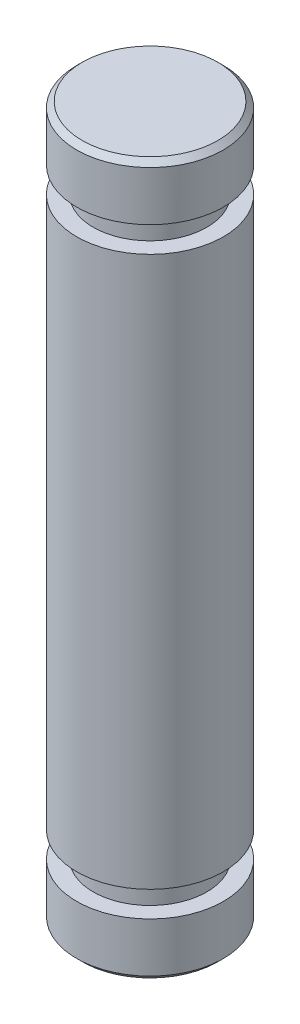
ISO-10303-21;
HEADER;
FILE_DESCRIPTION(('STEP AP214'),'2;1');
FILE_NAME('part.step','',(''),(''),'','','');
FILE_SCHEMA(('AUTOMOTIVE_DESIGN { 1 0 10303 214 1 1 1 1 }'));
ENDSEC;
DATA;
#1=APPLICATION_CONTEXT('core data for automotive mechanical design processes');
#2=APPLICATION_PROTOCOL_DEFINITION('international standard','automotive_design',2000,#1);
#3=PRODUCT_CONTEXT('',#1,'mechanical');
#4=PRODUCT('Part','Part','',(#3));
#5=PRODUCT_RELATED_PRODUCT_CATEGORY('part','',(#4));
#6=PRODUCT_DEFINITION_FORMATION('','',#4);
#7=PRODUCT_DEFINITION_CONTEXT('part definition',#1,'design');
#8=PRODUCT_DEFINITION('design','',#6,#7);
#9=PRODUCT_DEFINITION_SHAPE('','',#8);
#10=(LENGTH_UNIT() NAMED_UNIT(*) SI_UNIT(.MILLI.,.METRE.));
#11=(NAMED_UNIT(*) PLANE_ANGLE_UNIT() SI_UNIT($,.RADIAN.));
#12=(NAMED_UNIT(*) SI_UNIT($,.STERADIAN.) SOLID_ANGLE_UNIT());
#13=UNCERTAINTY_MEASURE_WITH_UNIT(LENGTH_MEASURE(1.E-05),#10,'distance_accuracy_value','');
#14=(GEOMETRIC_REPRESENTATION_CONTEXT(3) GLOBAL_UNCERTAINTY_ASSIGNED_CONTEXT((#13)) GLOBAL_UNIT_ASSIGNED_CONTEXT((#10,
#11,#12)) REPRESENTATION_CONTEXT('',''));
#15=CARTESIAN_POINT('',(0.,0.,0.));
#16=DIRECTION('',(0.,0.,1.));
#17=DIRECTION('',(1.,0.,0.));
#18=AXIS2_PLACEMENT_3D('',#15,#16,#17);
#19=CARTESIAN_POINT('',(2.,0.,0.));
#20=DIRECTION('',(0.,-1.,0.));
#21=DIRECTION('',(0.,0.,-1.));
#22=AXIS2_PLACEMENT_3D('',#19,#20,#21);
#23=PLANE('',#22);
#24=CARTESIAN_POINT('',(0.,0.,0.));
#25=DIRECTION('',(0.,-1.,0.));
#26=DIRECTION('',(0.,0.,-1.));
#27=AXIS2_PLACEMENT_3D('',#24,#25,#26);
#28=CIRCLE('',#27,1.85);
#29=CARTESIAN_POINT('',(0.,0.,-1.85));
#30=VERTEX_POINT('',#29);
#31=EDGE_CURVE('E46',#30,#30,#28,.T.);
#32=ORIENTED_EDGE('',*,*,#31,.T.);
#33=EDGE_LOOP('',(#32));
#34=FACE_BOUND('',#33,.T.);
#35=ADVANCED_FACE('F31',(#34),#23,.T.);
#36=CARTESIAN_POINT('',(0.,19.4,0.));
#37=DIRECTION('',(0.,1.,0.));
#38=DIRECTION('',(0.,0.,1.));
#39=AXIS2_PLACEMENT_3D('',#36,#37,#38);
#40=PLANE('',#39);
#41=CARTESIAN_POINT('',(0.,19.4,0.));
#42=DIRECTION('',(0.,1.,0.));
#43=DIRECTION('',(0.,0.,1.));
#44=AXIS2_PLACEMENT_3D('',#41,#42,#43);
#45=CIRCLE('',#44,1.85000000000001);
#46=CARTESIAN_POINT('',(0.,19.4,1.85000000000001));
#47=VERTEX_POINT('',#46);
#48=EDGE_CURVE('E10',#47,#47,#45,.T.);
#49=ORIENTED_EDGE('',*,*,#48,.T.);
#50=EDGE_LOOP('',(#49));
#51=FACE_BOUND('',#50,.T.);
#52=ADVANCED_FACE('F94',(#51),#40,.T.);
#53=CARTESIAN_POINT('',(0.,0.,0.));
#54=DIRECTION('',(0.,-1.,0.));
#55=DIRECTION('',(0.,0.,-1.));
#56=AXIS2_PLACEMENT_3D('',#53,#54,#55);
#57=CYLINDRICAL_SURFACE('',#56,2.);
#58=CARTESIAN_POINT('',(0.,19.25,0.));
#59=DIRECTION('',(0.,1.,0.));
#60=DIRECTION('',(0.,0.,1.));
#61=AXIS2_PLACEMENT_3D('',#58,#59,#60);
#62=CIRCLE('',#61,2.);
#63=CARTESIAN_POINT('',(0.,19.25,2.));
#64=VERTEX_POINT('',#63);
#65=EDGE_CURVE('E38',#64,#64,#62,.F.);
#66=ORIENTED_EDGE('',*,*,#65,.T.);
#67=EDGE_LOOP('',(#66));
#68=FACE_BOUND('',#67,.T.);
#69=CARTESIAN_POINT('',(0.,17.9,0.));
#70=DIRECTION('',(0.,-1.,0.));
#71=DIRECTION('',(0.,0.,-1.));
#72=AXIS2_PLACEMENT_3D('',#69,#70,#71);
#73=CIRCLE('',#72,2.);
#74=CARTESIAN_POINT('',(0.,17.9,-2.));
#75=VERTEX_POINT('',#74);
#76=EDGE_CURVE('E51',#75,#75,#73,.T.);
#77=ORIENTED_EDGE('',*,*,#76,.F.);
#78=EDGE_LOOP('',(#77));
#79=FACE_BOUND('',#78,.T.);
#80=ADVANCED_FACE('F100',(#68,#79),#57,.T.);
#81=CARTESIAN_POINT('',(2.,17.9,0.));
#82=DIRECTION('',(0.,-1.,0.));
#83=DIRECTION('',(0.,0.,-1.));
#84=AXIS2_PLACEMENT_3D('',#81,#82,#83);
#85=PLANE('',#84);
#86=ORIENTED_EDGE('',*,*,#76,.T.);
#87=EDGE_LOOP('',(#86));
#88=FACE_BOUND('',#87,.T.);
#89=CARTESIAN_POINT('',(0.,17.9,0.));
#90=DIRECTION('',(0.,-1.,0.));
#91=DIRECTION('',(0.,0.,-1.));
#92=AXIS2_PLACEMENT_3D('',#89,#90,#91);
#93=CIRCLE('',#92,1.55);
#94=CARTESIAN_POINT('',(0.,17.9,-1.55));
#95=VERTEX_POINT('',#94);
#96=EDGE_CURVE('E54',#95,#95,#93,.T.);
#97=ORIENTED_EDGE('',*,*,#96,.F.);
#98=EDGE_LOOP('',(#97));
#99=FACE_BOUND('',#98,.T.);
#100=ADVANCED_FACE('F135',(#88,#99),#85,.T.);
#101=CARTESIAN_POINT('',(0.,0.,0.));
#102=DIRECTION('',(0.,-1.,0.));
#103=DIRECTION('',(0.,0.,-1.));
#104=AXIS2_PLACEMENT_3D('',#101,#102,#103);
#105=CYLINDRICAL_SURFACE('',#104,1.55);
#106=ORIENTED_EDGE('',*,*,#96,.T.);
#107=EDGE_LOOP('',(#106));
#108=FACE_BOUND('',#107,.T.);
#109=CARTESIAN_POINT('',(0.,17.2,0.));
#110=DIRECTION('',(0.,-1.,0.));
#111=DIRECTION('',(0.,0.,-1.));
#112=AXIS2_PLACEMENT_3D('',#109,#110,#111);
#113=CIRCLE('',#112,1.55);
#114=CARTESIAN_POINT('',(0.,17.2,-1.55));
#115=VERTEX_POINT('',#114);
#116=EDGE_CURVE('E57',#115,#115,#113,.T.);
#117=ORIENTED_EDGE('',*,*,#116,.F.);
#118=EDGE_LOOP('',(#117));
#119=FACE_BOUND('',#118,.T.);
#120=ADVANCED_FACE('F184',(#108,#119),#105,.T.);
#121=CARTESIAN_POINT('',(1.55,17.2,0.));
#122=DIRECTION('',(0.,1.,0.));
#123=DIRECTION('',(0.,0.,1.));
#124=AXIS2_PLACEMENT_3D('',#121,#122,#123);
#125=PLANE('',#124);
#126=ORIENTED_EDGE('',*,*,#116,.T.);
#127=EDGE_LOOP('',(#126));
#128=FACE_BOUND('',#127,.T.);
#129=CARTESIAN_POINT('',(0.,17.2,0.));
#130=DIRECTION('',(0.,-1.,0.));
#131=DIRECTION('',(0.,0.,-1.));
#132=AXIS2_PLACEMENT_3D('',#129,#130,#131);
#133=CIRCLE('',#132,2.);
#134=CARTESIAN_POINT('',(0.,17.2,-2.));
#135=VERTEX_POINT('',#134);
#136=EDGE_CURVE('E60',#135,#135,#133,.T.);
#137=ORIENTED_EDGE('',*,*,#136,.F.);
#138=EDGE_LOOP('',(#137));
#139=FACE_BOUND('',#138,.T.);
#140=ADVANCED_FACE('F174',(#128,#139),#125,.T.);
#141=CARTESIAN_POINT('',(0.,0.,0.));
#142=DIRECTION('',(0.,-1.,0.));
#143=DIRECTION('',(0.,0.,-1.));
#144=AXIS2_PLACEMENT_3D('',#141,#142,#143);
#145=CYLINDRICAL_SURFACE('',#144,2.);
#146=ORIENTED_EDGE('',*,*,#136,.T.);
#147=EDGE_LOOP('',(#146));
#148=FACE_BOUND('',#147,.T.);
#149=CARTESIAN_POINT('',(0.,2.2,0.));
#150=DIRECTION('',(0.,-1.,0.));
#151=DIRECTION('',(0.,0.,-1.));
#152=AXIS2_PLACEMENT_3D('',#149,#150,#151);
#153=CIRCLE('',#152,2.);
#154=CARTESIAN_POINT('',(0.,2.2,-2.));
#155=VERTEX_POINT('',#154);
#156=EDGE_CURVE('E63',#155,#155,#153,.T.);
#157=ORIENTED_EDGE('',*,*,#156,.F.);
#158=EDGE_LOOP('',(#157));
#159=FACE_BOUND('',#158,.T.);
#160=ADVANCED_FACE('F164',(#148,#159),#145,.T.);
#161=CARTESIAN_POINT('',(2.,2.2,0.));
#162=DIRECTION('',(0.,-1.,0.));
#163=DIRECTION('',(0.,0.,-1.));
#164=AXIS2_PLACEMENT_3D('',#161,#162,#163);
#165=PLANE('',#164);
#166=ORIENTED_EDGE('',*,*,#156,.T.);
#167=EDGE_LOOP('',(#166));
#168=FACE_BOUND('',#167,.T.);
#169=CARTESIAN_POINT('',(0.,2.2,0.));
#170=DIRECTION('',(0.,-1.,0.));
#171=DIRECTION('',(0.,0.,-1.));
#172=AXIS2_PLACEMENT_3D('',#169,#170,#171);
#173=CIRCLE('',#172,1.55);
#174=CARTESIAN_POINT('',(0.,2.2,-1.55));
#175=VERTEX_POINT('',#174);
#176=EDGE_CURVE('E66',#175,#175,#173,.T.);
#177=ORIENTED_EDGE('',*,*,#176,.F.);
#178=EDGE_LOOP('',(#177));
#179=FACE_BOUND('',#178,.T.);
#180=ADVANCED_FACE('F90',(#168,#179),#165,.T.);
#181=CARTESIAN_POINT('',(0.,0.,0.));
#182=DIRECTION('',(0.,-1.,0.));
#183=DIRECTION('',(0.,0.,-1.));
#184=AXIS2_PLACEMENT_3D('',#181,#182,#183);
#185=CYLINDRICAL_SURFACE('',#184,1.55);
#186=ORIENTED_EDGE('',*,*,#176,.T.);
#187=EDGE_LOOP('',(#186));
#188=FACE_BOUND('',#187,.T.);
#189=CARTESIAN_POINT('',(0.,1.5,0.));
#190=DIRECTION('',(0.,-1.,0.));
#191=DIRECTION('',(0.,0.,-1.));
#192=AXIS2_PLACEMENT_3D('',#189,#190,#191);
#193=CIRCLE('',#192,1.55);
#194=CARTESIAN_POINT('',(0.,1.5,-1.55));
#195=VERTEX_POINT('',#194);
#196=EDGE_CURVE('E69',#195,#195,#193,.T.);
#197=ORIENTED_EDGE('',*,*,#196,.F.);
#198=EDGE_LOOP('',(#197));
#199=FACE_BOUND('',#198,.T.);
#200=ADVANCED_FACE('F80',(#188,#199),#185,.T.);
#201=CARTESIAN_POINT('',(1.55,1.5,0.));
#202=DIRECTION('',(0.,1.,0.));
#203=DIRECTION('',(0.,0.,1.));
#204=AXIS2_PLACEMENT_3D('',#201,#202,#203);
#205=PLANE('',#204);
#206=ORIENTED_EDGE('',*,*,#196,.T.);
#207=EDGE_LOOP('',(#206));
#208=FACE_BOUND('',#207,.T.);
#209=CARTESIAN_POINT('',(0.,1.5,0.));
#210=DIRECTION('',(0.,-1.,0.));
#211=DIRECTION('',(0.,0.,-1.));
#212=AXIS2_PLACEMENT_3D('',#209,#210,#211);
#213=CIRCLE('',#212,2.);
#214=CARTESIAN_POINT('',(0.,1.5,-2.));
#215=VERTEX_POINT('',#214);
#216=EDGE_CURVE('E72',#215,#215,#213,.T.);
#217=ORIENTED_EDGE('',*,*,#216,.F.);
#218=EDGE_LOOP('',(#217));
#219=FACE_BOUND('',#218,.T.);
#220=ADVANCED_FACE('F78',(#208,#219),#205,.T.);
#221=CARTESIAN_POINT('',(0.,0.,0.));
#222=DIRECTION('',(0.,-1.,0.));
#223=DIRECTION('',(0.,0.,-1.));
#224=AXIS2_PLACEMENT_3D('',#221,#222,#223);
#225=CYLINDRICAL_SURFACE('',#224,2.);
#226=CARTESIAN_POINT('',(0.,0.149999999999998,0.));
#227=DIRECTION('',(0.,-1.,0.));
#228=DIRECTION('',(0.,0.,-1.));
#229=AXIS2_PLACEMENT_3D('',#226,#227,#228);
#230=CIRCLE('',#229,2.);
#231=CARTESIAN_POINT('',(0.,0.149999999999998,-2.));
#232=VERTEX_POINT('',#231);
#233=EDGE_CURVE('E42',#232,#232,#230,.F.);
#234=ORIENTED_EDGE('',*,*,#233,.T.);
#235=EDGE_LOOP('',(#234));
#236=FACE_BOUND('',#235,.T.);
#237=ORIENTED_EDGE('',*,*,#216,.T.);
#238=EDGE_LOOP('',(#237));
#239=FACE_BOUND('',#238,.T.);
#240=ADVANCED_FACE('F76',(#236,#239),#225,.T.);
#241=CARTESIAN_POINT('',(0.,0.,0.));
#242=DIRECTION('',(0.,1.,0.));
#243=DIRECTION('',(0.,0.,1.));
#244=AXIS2_PLACEMENT_3D('',#241,#242,#243);
#245=CONICAL_SURFACE('',#244,1.85,0.785398163397451);
#246=ORIENTED_EDGE('',*,*,#233,.F.);
#247=EDGE_LOOP('',(#246));
#248=FACE_BOUND('',#247,.T.);
#249=ORIENTED_EDGE('',*,*,#31,.F.);
#250=EDGE_LOOP('',(#249));
#251=FACE_BOUND('',#250,.T.);
#252=ADVANCED_FACE('F87',(#248,#251),#245,.T.);
#253=CARTESIAN_POINT('',(0.,19.25,0.));
#254=DIRECTION('',(0.,-1.,0.));
#255=DIRECTION('',(0.,0.,-1.));
#256=AXIS2_PLACEMENT_3D('',#253,#254,#255);
#257=CONICAL_SURFACE('',#256,2.,0.785398163397451);
#258=ORIENTED_EDGE('',*,*,#48,.F.);
#259=EDGE_LOOP('',(#258));
#260=FACE_BOUND('',#259,.T.);
#261=ORIENTED_EDGE('',*,*,#65,.F.);
#262=EDGE_LOOP('',(#261));
#263=FACE_BOUND('',#262,.T.);
#264=ADVANCED_FACE('F33',(#260,#263),#257,.T.);
#265=CLOSED_SHELL('',(#35,#52,#80,#100,#120,#140,#160,#180,#200,#220,#240,#252,#264));
#266=MANIFOLD_SOLID_BREP('B2',#265);
#267=ADVANCED_BREP_SHAPE_REPRESENTATION('',(#18,#266),#14);
#268=SHAPE_DEFINITION_REPRESENTATION(#9,#267);
ENDSEC;
END-ISO-10303-21;
